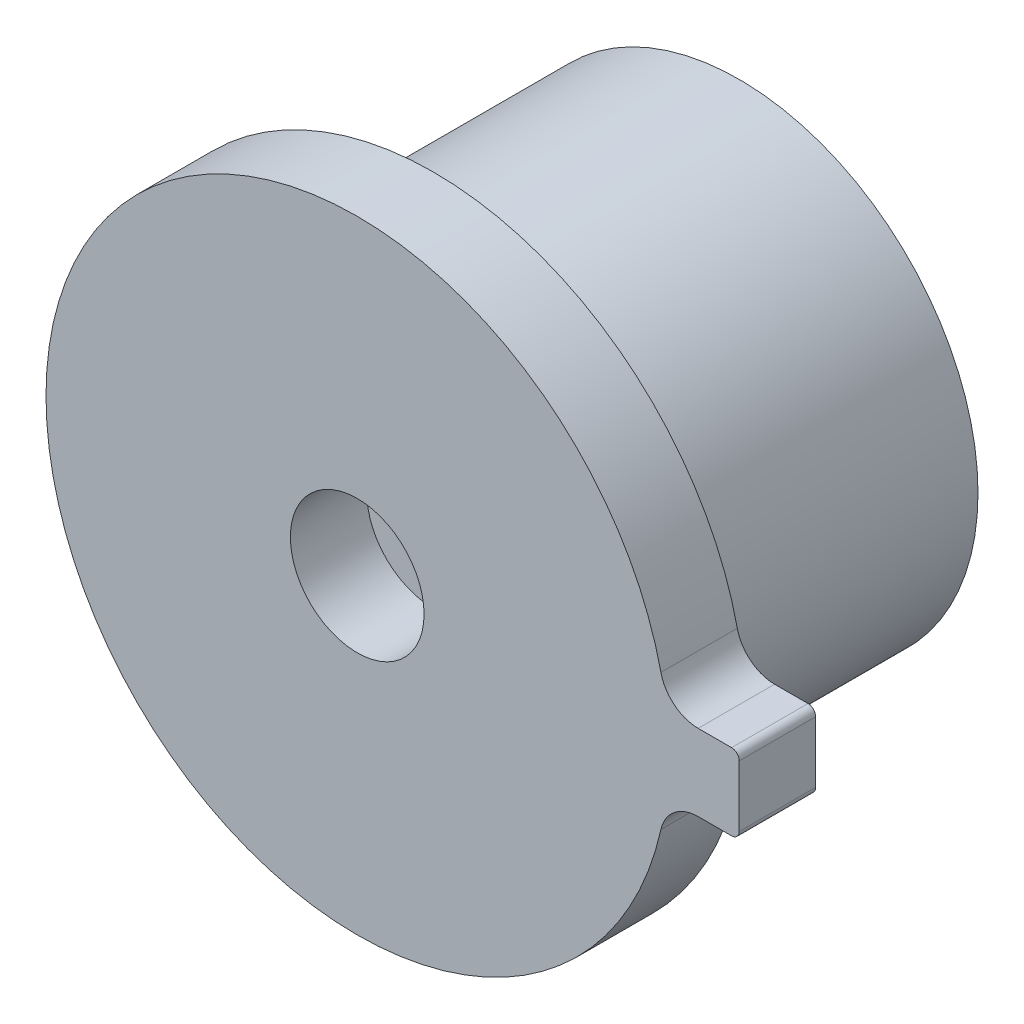
ISO-10303-21;
HEADER;
FILE_DESCRIPTION(('STEP AP214'),'2;1');
FILE_NAME('part.step','',(''),(''),'','','');
FILE_SCHEMA(('AUTOMOTIVE_DESIGN { 1 0 10303 214 1 1 1 1 }'));
ENDSEC;
DATA;
#1=APPLICATION_CONTEXT('core data for automotive mechanical design processes');
#2=APPLICATION_PROTOCOL_DEFINITION('international standard','automotive_design',2000,#1);
#3=PRODUCT_CONTEXT('',#1,'mechanical');
#4=PRODUCT('Part','Part','',(#3));
#5=PRODUCT_RELATED_PRODUCT_CATEGORY('part','',(#4));
#6=PRODUCT_DEFINITION_FORMATION('','',#4);
#7=PRODUCT_DEFINITION_CONTEXT('part definition',#1,'design');
#8=PRODUCT_DEFINITION('design','',#6,#7);
#9=PRODUCT_DEFINITION_SHAPE('','',#8);
#10=(LENGTH_UNIT() NAMED_UNIT(*) SI_UNIT(.MILLI.,.METRE.));
#11=(NAMED_UNIT(*) PLANE_ANGLE_UNIT() SI_UNIT($,.RADIAN.));
#12=(NAMED_UNIT(*) SI_UNIT($,.STERADIAN.) SOLID_ANGLE_UNIT());
#13=UNCERTAINTY_MEASURE_WITH_UNIT(LENGTH_MEASURE(1.E-05),#10,'distance_accuracy_value','');
#14=(GEOMETRIC_REPRESENTATION_CONTEXT(3) GLOBAL_UNCERTAINTY_ASSIGNED_CONTEXT((#13)) GLOBAL_UNIT_ASSIGNED_CONTEXT((#10,
#11,#12)) REPRESENTATION_CONTEXT('',''));
#15=CARTESIAN_POINT('',(0.,0.,0.));
#16=DIRECTION('',(0.,0.,1.));
#17=DIRECTION('',(1.,0.,0.));
#18=AXIS2_PLACEMENT_3D('',#15,#16,#17);
#19=CARTESIAN_POINT('',(0.,0.,16.));
#20=DIRECTION('',(0.,0.,-1.));
#21=DIRECTION('',(-1.,0.,0.));
#22=AXIS2_PLACEMENT_3D('',#19,#20,#21);
#23=CYLINDRICAL_SURFACE('',#22,2.);
#24=CARTESIAN_POINT('',(0.,0.,0.));
#25=DIRECTION('',(0.,0.,1.));
#26=DIRECTION('',(1.,0.,0.));
#27=AXIS2_PLACEMENT_3D('',#24,#25,#26);
#28=CIRCLE('',#27,2.);
#29=CARTESIAN_POINT('',(2.,0.,0.));
#30=VERTEX_POINT('',#29);
#31=EDGE_CURVE('E129',#30,#30,#28,.T.);
#32=ORIENTED_EDGE('',*,*,#31,.F.);
#33=EDGE_LOOP('',(#32));
#34=FACE_BOUND('',#33,.T.);
#35=CARTESIAN_POINT('',(0.,0.,16.));
#36=DIRECTION('',(0.,0.,1.));
#37=DIRECTION('',(1.,0.,0.));
#38=AXIS2_PLACEMENT_3D('',#35,#36,#37);
#39=CIRCLE('',#38,2.);
#40=CARTESIAN_POINT('',(2.,0.,16.));
#41=VERTEX_POINT('',#40);
#42=EDGE_CURVE('E145',#41,#41,#39,.T.);
#43=ORIENTED_EDGE('',*,*,#42,.T.);
#44=EDGE_LOOP('',(#43));
#45=FACE_BOUND('',#44,.T.);
#46=ADVANCED_FACE('F38',(#34,#45),#23,.F.);
#47=CARTESIAN_POINT('',(0.,0.,0.));
#48=DIRECTION('',(0.,0.,1.));
#49=DIRECTION('',(1.,0.,0.));
#50=AXIS2_PLACEMENT_3D('',#47,#48,#49);
#51=PLANE('',#50);
#52=CARTESIAN_POINT('',(6.,0.,0.));
#53=DIRECTION('',(0.,0.,-1.));
#54=DIRECTION('',(-1.,0.,0.));
#55=AXIS2_PLACEMENT_3D('',#52,#53,#54);
#56=CIRCLE('',#55,2.75);
#57=CARTESIAN_POINT('',(3.25,0.,0.));
#58=VERTEX_POINT('',#57);
#59=EDGE_CURVE('E265',#58,#58,#56,.T.);
#60=ORIENTED_EDGE('',*,*,#59,.F.);
#61=EDGE_LOOP('',(#60));
#62=FACE_BOUND('',#61,.T.);
#63=CARTESIAN_POINT('',(-3.,5.19615242270663,0.));
#64=DIRECTION('',(0.,0.,-1.));
#65=DIRECTION('',(-1.,0.,0.));
#66=AXIS2_PLACEMENT_3D('',#63,#64,#65);
#67=CIRCLE('',#66,2.75);
#68=CARTESIAN_POINT('',(-5.75,5.19615242270663,0.));
#69=VERTEX_POINT('',#68);
#70=EDGE_CURVE('E257',#69,#69,#67,.T.);
#71=ORIENTED_EDGE('',*,*,#70,.F.);
#72=EDGE_LOOP('',(#71));
#73=FACE_BOUND('',#72,.T.);
#74=CARTESIAN_POINT('',(-3.,-5.19615242270663,0.));
#75=DIRECTION('',(0.,0.,-1.));
#76=DIRECTION('',(-1.,0.,0.));
#77=AXIS2_PLACEMENT_3D('',#74,#75,#76);
#78=CIRCLE('',#77,2.75);
#79=CARTESIAN_POINT('',(-5.75,-5.19615242270663,0.));
#80=VERTEX_POINT('',#79);
#81=EDGE_CURVE('E249',#80,#80,#78,.T.);
#82=ORIENTED_EDGE('',*,*,#81,.F.);
#83=EDGE_LOOP('',(#82));
#84=FACE_BOUND('',#83,.T.);
#85=CARTESIAN_POINT('',(0.,0.,0.));
#86=DIRECTION('',(0.,0.,1.));
#87=DIRECTION('',(1.,0.,0.));
#88=AXIS2_PLACEMENT_3D('',#85,#86,#87);
#89=CIRCLE('',#88,12.5);
#90=CARTESIAN_POINT('',(12.5,0.,0.));
#91=VERTEX_POINT('',#90);
#92=EDGE_CURVE('E142',#91,#91,#89,.T.);
#93=ORIENTED_EDGE('',*,*,#92,.F.);
#94=EDGE_LOOP('',(#93));
#95=FACE_BOUND('',#94,.T.);
#96=ORIENTED_EDGE('',*,*,#31,.T.);
#97=EDGE_LOOP('',(#96));
#98=FACE_BOUND('',#97,.T.);
#99=ADVANCED_FACE('F231',(#62,#73,#84,#95,#98),#51,.F.);
#100=CARTESIAN_POINT('',(0.,0.,16.));
#101=DIRECTION('',(0.,0.,-1.));
#102=DIRECTION('',(-1.,0.,0.));
#103=AXIS2_PLACEMENT_3D('',#100,#101,#102);
#104=CYLINDRICAL_SURFACE('',#103,12.5);
#105=CARTESIAN_POINT('',(0.,0.,16.));
#106=DIRECTION('',(0.,0.,1.));
#107=DIRECTION('',(1.,0.,0.));
#108=AXIS2_PLACEMENT_3D('',#105,#106,#107);
#109=CIRCLE('',#108,12.5);
#110=CARTESIAN_POINT('',(12.5,0.,16.));
#111=VERTEX_POINT('',#110);
#112=EDGE_CURVE('E135',#111,#111,#109,.T.);
#113=ORIENTED_EDGE('',*,*,#112,.F.);
#114=EDGE_LOOP('',(#113));
#115=FACE_BOUND('',#114,.T.);
#116=ORIENTED_EDGE('',*,*,#92,.T.);
#117=EDGE_LOOP('',(#116));
#118=FACE_BOUND('',#117,.T.);
#119=ADVANCED_FACE('F229',(#115,#118),#104,.T.);
#120=CARTESIAN_POINT('',(0.,0.,20.));
#121=DIRECTION('',(0.,0.,1.));
#122=DIRECTION('',(1.,0.,0.));
#123=AXIS2_PLACEMENT_3D('',#120,#121,#122);
#124=PLANE('',#123);
#125=DIRECTION('',(1.,0.,0.));
#126=VECTOR('',#125,1.);
#127=CARTESIAN_POINT('',(20.,-2.,20.));
#128=LINE('',#127,#126);
#129=CARTESIAN_POINT('',(17.8505461799163,-2.,20.));
#130=VERTEX_POINT('',#129);
#131=CARTESIAN_POINT('',(19.6,-2.,20.));
#132=VERTEX_POINT('',#131);
#133=EDGE_CURVE('E199',#130,#132,#128,.T.);
#134=ORIENTED_EDGE('',*,*,#133,.T.);
#135=CARTESIAN_POINT('',(19.6,-1.6,20.));
#136=DIRECTION('',(0.,0.,1.));
#137=DIRECTION('',(1.,0.,0.));
#138=AXIS2_PLACEMENT_3D('',#135,#136,#137);
#139=CIRCLE('',#138,0.4);
#140=CARTESIAN_POINT('',(20.,-1.6,20.));
#141=VERTEX_POINT('',#140);
#142=EDGE_CURVE('E167',#132,#141,#139,.T.);
#143=ORIENTED_EDGE('',*,*,#142,.T.);
#144=DIRECTION('',(0.,1.,0.));
#145=VECTOR('',#144,1.);
#146=CARTESIAN_POINT('',(20.,2.,20.));
#147=LINE('',#146,#145);
#148=CARTESIAN_POINT('',(20.,1.6,20.));
#149=VERTEX_POINT('',#148);
#150=EDGE_CURVE('E198',#141,#149,#147,.T.);
#151=ORIENTED_EDGE('',*,*,#150,.T.);
#152=CARTESIAN_POINT('',(19.6,1.6,20.));
#153=DIRECTION('',(0.,0.,1.));
#154=DIRECTION('',(1.,0.,0.));
#155=AXIS2_PLACEMENT_3D('',#152,#153,#154);
#156=CIRCLE('',#155,0.4);
#157=CARTESIAN_POINT('',(19.6,2.,20.));
#158=VERTEX_POINT('',#157);
#159=EDGE_CURVE('E164',#149,#158,#156,.T.);
#160=ORIENTED_EDGE('',*,*,#159,.T.);
#161=DIRECTION('',(-1.,0.,0.));
#162=VECTOR('',#161,1.);
#163=CARTESIAN_POINT('',(20.,2.,20.));
#164=LINE('',#163,#162);
#165=CARTESIAN_POINT('',(17.8505461799163,2.,20.));
#166=VERTEX_POINT('',#165);
#167=EDGE_CURVE('E110',#158,#166,#164,.T.);
#168=ORIENTED_EDGE('',*,*,#167,.T.);
#169=CARTESIAN_POINT('',(17.8505461799163,4.,20.));
#170=DIRECTION('',(0.,0.,1.));
#171=DIRECTION('',(1.,0.,0.));
#172=AXIS2_PLACEMENT_3D('',#169,#170,#171);
#173=CIRCLE('',#172,2.);
#174=CARTESIAN_POINT('',(15.8989440576667,3.56267957236056,20.));
#175=VERTEX_POINT('',#174);
#176=EDGE_CURVE('E104',#166,#175,#173,.F.);
#177=ORIENTED_EDGE('',*,*,#176,.T.);
#178=CARTESIAN_POINT('',(0.,0.,20.));
#179=DIRECTION('',(0.,0.,1.));
#180=DIRECTION('',(1.,0.,0.));
#181=AXIS2_PLACEMENT_3D('',#178,#179,#180);
#182=CIRCLE('',#181,16.2932227592987);
#183=CARTESIAN_POINT('',(15.8989440576667,-3.56267957236056,20.));
#184=VERTEX_POINT('',#183);
#185=EDGE_CURVE('E109',#175,#184,#182,.T.);
#186=ORIENTED_EDGE('',*,*,#185,.T.);
#187=CARTESIAN_POINT('',(17.8505461799163,-4.,20.));
#188=DIRECTION('',(0.,0.,1.));
#189=DIRECTION('',(1.,0.,0.));
#190=AXIS2_PLACEMENT_3D('',#187,#188,#189);
#191=CIRCLE('',#190,2.);
#192=EDGE_CURVE('E153',#184,#130,#191,.F.);
#193=ORIENTED_EDGE('',*,*,#192,.T.);
#194=EDGE_LOOP('',(#134,#143,#151,#160,#168,#177,#186,#193));
#195=FACE_BOUND('',#194,.T.);
#196=CARTESIAN_POINT('',(0.,0.,20.));
#197=DIRECTION('',(0.,0.,1.));
#198=DIRECTION('',(1.,0.,0.));
#199=AXIS2_PLACEMENT_3D('',#196,#197,#198);
#200=CIRCLE('',#199,3.5);
#201=CARTESIAN_POINT('',(3.5,0.,20.));
#202=VERTEX_POINT('',#201);
#203=EDGE_CURVE('E216',#202,#202,#200,.T.);
#204=ORIENTED_EDGE('',*,*,#203,.F.);
#205=EDGE_LOOP('',(#204));
#206=FACE_BOUND('',#205,.T.);
#207=ADVANCED_FACE('F107',(#195,#206),#124,.T.);
#208=CARTESIAN_POINT('',(0.,0.,16.));
#209=DIRECTION('',(0.,0.,1.));
#210=DIRECTION('',(1.,0.,0.));
#211=AXIS2_PLACEMENT_3D('',#208,#209,#210);
#212=PLANE('',#211);
#213=ORIENTED_EDGE('',*,*,#112,.T.);
#214=EDGE_LOOP('',(#213));
#215=FACE_BOUND('',#214,.T.);
#216=DIRECTION('',(0.,1.,0.));
#217=VECTOR('',#216,1.);
#218=CARTESIAN_POINT('',(20.,2.,16.));
#219=LINE('',#218,#217);
#220=CARTESIAN_POINT('',(20.,-1.6,16.));
#221=VERTEX_POINT('',#220);
#222=CARTESIAN_POINT('',(20.,1.6,16.));
#223=VERTEX_POINT('',#222);
#224=EDGE_CURVE('E185',#221,#223,#219,.T.);
#225=ORIENTED_EDGE('',*,*,#224,.F.);
#226=CARTESIAN_POINT('',(19.6,-1.6,16.));
#227=DIRECTION('',(0.,0.,1.));
#228=DIRECTION('',(1.,0.,0.));
#229=AXIS2_PLACEMENT_3D('',#226,#227,#228);
#230=CIRCLE('',#229,0.4);
#231=CARTESIAN_POINT('',(19.6,-2.,16.));
#232=VERTEX_POINT('',#231);
#233=EDGE_CURVE('E47',#221,#232,#230,.F.);
#234=ORIENTED_EDGE('',*,*,#233,.T.);
#235=DIRECTION('',(1.,0.,0.));
#236=VECTOR('',#235,1.);
#237=CARTESIAN_POINT('',(20.,-2.,16.));
#238=LINE('',#237,#236);
#239=CARTESIAN_POINT('',(17.8505461799163,-2.,16.));
#240=VERTEX_POINT('',#239);
#241=EDGE_CURVE('E183',#240,#232,#238,.T.);
#242=ORIENTED_EDGE('',*,*,#241,.F.);
#243=CARTESIAN_POINT('',(17.8505461799163,-4.,16.));
#244=DIRECTION('',(0.,0.,1.));
#245=DIRECTION('',(1.,0.,0.));
#246=AXIS2_PLACEMENT_3D('',#243,#244,#245);
#247=CIRCLE('',#246,2.);
#248=CARTESIAN_POINT('',(15.8989440576667,-3.56267957236056,16.));
#249=VERTEX_POINT('',#248);
#250=EDGE_CURVE('E156',#240,#249,#247,.T.);
#251=ORIENTED_EDGE('',*,*,#250,.T.);
#252=CARTESIAN_POINT('',(0.,0.,16.));
#253=DIRECTION('',(0.,0.,1.));
#254=DIRECTION('',(1.,0.,0.));
#255=AXIS2_PLACEMENT_3D('',#252,#253,#254);
#256=CIRCLE('',#255,16.2932227592987);
#257=CARTESIAN_POINT('',(15.8989440576667,3.56267957236056,16.));
#258=VERTEX_POINT('',#257);
#259=EDGE_CURVE('E130',#258,#249,#256,.T.);
#260=ORIENTED_EDGE('',*,*,#259,.F.);
#261=CARTESIAN_POINT('',(17.8505461799163,4.,16.));
#262=DIRECTION('',(0.,0.,1.));
#263=DIRECTION('',(1.,0.,0.));
#264=AXIS2_PLACEMENT_3D('',#261,#262,#263);
#265=CIRCLE('',#264,2.);
#266=CARTESIAN_POINT('',(17.8505461799163,2.,16.));
#267=VERTEX_POINT('',#266);
#268=EDGE_CURVE('E117',#258,#267,#265,.T.);
#269=ORIENTED_EDGE('',*,*,#268,.T.);
#270=DIRECTION('',(-1.,0.,0.));
#271=VECTOR('',#270,1.);
#272=CARTESIAN_POINT('',(20.,2.,16.));
#273=LINE('',#272,#271);
#274=CARTESIAN_POINT('',(19.6,2.,16.));
#275=VERTEX_POINT('',#274);
#276=EDGE_CURVE('E219',#275,#267,#273,.T.);
#277=ORIENTED_EDGE('',*,*,#276,.F.);
#278=CARTESIAN_POINT('',(19.6,1.6,16.));
#279=DIRECTION('',(0.,0.,1.));
#280=DIRECTION('',(1.,0.,0.));
#281=AXIS2_PLACEMENT_3D('',#278,#279,#280);
#282=CIRCLE('',#281,0.4);
#283=EDGE_CURVE('E59',#275,#223,#282,.F.);
#284=ORIENTED_EDGE('',*,*,#283,.T.);
#285=EDGE_LOOP('',(#225,#234,#242,#251,#260,#269,#277,#284));
#286=FACE_BOUND('',#285,.T.);
#287=ADVANCED_FACE('F182',(#215,#286),#212,.F.);
#288=CARTESIAN_POINT('',(0.,0.,20.));
#289=DIRECTION('',(0.,0.,-1.));
#290=DIRECTION('',(-1.,0.,0.));
#291=AXIS2_PLACEMENT_3D('',#288,#289,#290);
#292=CYLINDRICAL_SURFACE('',#291,16.2932227592987);
#293=ORIENTED_EDGE('',*,*,#259,.T.);
#294=DIRECTION('',(0.,0.,-1.));
#295=VECTOR('',#294,1.);
#296=CARTESIAN_POINT('',(15.8989440576667,-3.56267957236056,20.));
#297=LINE('',#296,#295);
#298=EDGE_CURVE('E127',#249,#184,#297,.F.);
#299=ORIENTED_EDGE('',*,*,#298,.T.);
#300=ORIENTED_EDGE('',*,*,#185,.F.);
#301=DIRECTION('',(0.,0.,-1.));
#302=VECTOR('',#301,1.);
#303=CARTESIAN_POINT('',(15.8989440576667,3.56267957236056,20.));
#304=LINE('',#303,#302);
#305=EDGE_CURVE('E124',#175,#258,#304,.T.);
#306=ORIENTED_EDGE('',*,*,#305,.T.);
#307=EDGE_LOOP('',(#293,#299,#300,#306));
#308=FACE_BOUND('',#307,.T.);
#309=ADVANCED_FACE('F123',(#308),#292,.T.);
#310=CARTESIAN_POINT('',(0.,0.,16.));
#311=DIRECTION('',(0.,0.,1.));
#312=DIRECTION('',(1.,0.,0.));
#313=AXIS2_PLACEMENT_3D('',#310,#311,#312);
#314=CYLINDRICAL_SURFACE('',#313,3.5);
#315=CARTESIAN_POINT('',(0.,0.,16.));
#316=DIRECTION('',(0.,0.,1.));
#317=DIRECTION('',(1.,0.,0.));
#318=AXIS2_PLACEMENT_3D('',#315,#316,#317);
#319=CIRCLE('',#318,3.5);
#320=CARTESIAN_POINT('',(3.5,0.,16.));
#321=VERTEX_POINT('',#320);
#322=EDGE_CURVE('E212',#321,#321,#319,.T.);
#323=ORIENTED_EDGE('',*,*,#322,.F.);
#324=EDGE_LOOP('',(#323));
#325=FACE_BOUND('',#324,.T.);
#326=ORIENTED_EDGE('',*,*,#203,.T.);
#327=EDGE_LOOP('',(#326));
#328=FACE_BOUND('',#327,.T.);
#329=ADVANCED_FACE('F313',(#325,#328),#314,.F.);
#330=CARTESIAN_POINT('',(0.,0.,16.));
#331=DIRECTION('',(0.,0.,1.));
#332=DIRECTION('',(1.,0.,0.));
#333=AXIS2_PLACEMENT_3D('',#330,#331,#332);
#334=PLANE('',#333);
#335=ORIENTED_EDGE('',*,*,#42,.F.);
#336=EDGE_LOOP('',(#335));
#337=FACE_BOUND('',#336,.T.);
#338=ORIENTED_EDGE('',*,*,#322,.T.);
#339=EDGE_LOOP('',(#338));
#340=FACE_BOUND('',#339,.T.);
#341=ADVANCED_FACE('F305',(#337,#340),#334,.T.);
#342=CARTESIAN_POINT('',(20.,2.,16.));
#343=DIRECTION('',(0.,1.,0.));
#344=DIRECTION('',(-1.,0.,0.));
#345=AXIS2_PLACEMENT_3D('',#342,#343,#344);
#346=PLANE('',#345);
#347=ORIENTED_EDGE('',*,*,#167,.F.);
#348=DIRECTION('',(0.,0.,1.));
#349=VECTOR('',#348,1.);
#350=CARTESIAN_POINT('',(19.6,2.,16.));
#351=LINE('',#350,#349);
#352=EDGE_CURVE('E11',#158,#275,#351,.F.);
#353=ORIENTED_EDGE('',*,*,#352,.T.);
#354=ORIENTED_EDGE('',*,*,#276,.T.);
#355=DIRECTION('',(0.,0.,-1.));
#356=VECTOR('',#355,1.);
#357=CARTESIAN_POINT('',(17.8505461799163,2.,16.));
#358=LINE('',#357,#356);
#359=EDGE_CURVE('E150',#267,#166,#358,.F.);
#360=ORIENTED_EDGE('',*,*,#359,.T.);
#361=EDGE_LOOP('',(#347,#353,#354,#360));
#362=FACE_BOUND('',#361,.T.);
#363=ADVANCED_FACE('F302',(#362),#346,.T.);
#364=CARTESIAN_POINT('',(20.,-2.,16.));
#365=DIRECTION('',(0.,-1.,0.));
#366=DIRECTION('',(1.,0.,0.));
#367=AXIS2_PLACEMENT_3D('',#364,#365,#366);
#368=PLANE('',#367);
#369=ORIENTED_EDGE('',*,*,#241,.T.);
#370=DIRECTION('',(0.,0.,1.));
#371=VECTOR('',#370,1.);
#372=CARTESIAN_POINT('',(19.6,-2.,16.));
#373=LINE('',#372,#371);
#374=EDGE_CURVE('E116',#232,#132,#373,.T.);
#375=ORIENTED_EDGE('',*,*,#374,.T.);
#376=ORIENTED_EDGE('',*,*,#133,.F.);
#377=DIRECTION('',(0.,0.,-1.));
#378=VECTOR('',#377,1.);
#379=CARTESIAN_POINT('',(17.8505461799163,-2.,16.));
#380=LINE('',#379,#378);
#381=EDGE_CURVE('E139',#130,#240,#380,.T.);
#382=ORIENTED_EDGE('',*,*,#381,.T.);
#383=EDGE_LOOP('',(#369,#375,#376,#382));
#384=FACE_BOUND('',#383,.T.);
#385=ADVANCED_FACE('F190',(#384),#368,.T.);
#386=CARTESIAN_POINT('',(20.,2.,16.));
#387=DIRECTION('',(1.,0.,0.));
#388=DIRECTION('',(0.,0.,-1.));
#389=AXIS2_PLACEMENT_3D('',#386,#387,#388);
#390=PLANE('',#389);
#391=ORIENTED_EDGE('',*,*,#150,.F.);
#392=DIRECTION('',(0.,0.,1.));
#393=VECTOR('',#392,1.);
#394=CARTESIAN_POINT('',(20.,-1.6,16.));
#395=LINE('',#394,#393);
#396=EDGE_CURVE('E174',#141,#221,#395,.F.);
#397=ORIENTED_EDGE('',*,*,#396,.T.);
#398=ORIENTED_EDGE('',*,*,#224,.T.);
#399=DIRECTION('',(0.,0.,1.));
#400=VECTOR('',#399,1.);
#401=CARTESIAN_POINT('',(20.,1.6,16.));
#402=LINE('',#401,#400);
#403=EDGE_CURVE('E170',#223,#149,#402,.T.);
#404=ORIENTED_EDGE('',*,*,#403,.T.);
#405=EDGE_LOOP('',(#391,#397,#398,#404));
#406=FACE_BOUND('',#405,.T.);
#407=ADVANCED_FACE('F201',(#406),#390,.T.);
#408=CARTESIAN_POINT('',(17.8505461799163,-4.,20.));
#409=DIRECTION('',(0.,0.,-1.));
#410=DIRECTION('',(-1.,0.,0.));
#411=AXIS2_PLACEMENT_3D('',#408,#409,#410);
#412=CYLINDRICAL_SURFACE('',#411,2.);
#413=ORIENTED_EDGE('',*,*,#250,.F.);
#414=ORIENTED_EDGE('',*,*,#381,.F.);
#415=ORIENTED_EDGE('',*,*,#192,.F.);
#416=ORIENTED_EDGE('',*,*,#298,.F.);
#417=EDGE_LOOP('',(#413,#414,#415,#416));
#418=FACE_BOUND('',#417,.T.);
#419=ADVANCED_FACE('F308',(#418),#412,.F.);
#420=CARTESIAN_POINT('',(17.8505461799163,4.,20.));
#421=DIRECTION('',(0.,0.,-1.));
#422=DIRECTION('',(-1.,0.,0.));
#423=AXIS2_PLACEMENT_3D('',#420,#421,#422);
#424=CYLINDRICAL_SURFACE('',#423,2.);
#425=ORIENTED_EDGE('',*,*,#176,.F.);
#426=ORIENTED_EDGE('',*,*,#359,.F.);
#427=ORIENTED_EDGE('',*,*,#268,.F.);
#428=ORIENTED_EDGE('',*,*,#305,.F.);
#429=EDGE_LOOP('',(#425,#426,#427,#428));
#430=FACE_BOUND('',#429,.T.);
#431=ADVANCED_FACE('F132',(#430),#424,.F.);
#432=CARTESIAN_POINT('',(19.6,-1.6,16.));
#433=DIRECTION('',(0.,0.,1.));
#434=DIRECTION('',(1.,0.,0.));
#435=AXIS2_PLACEMENT_3D('',#432,#433,#434);
#436=CYLINDRICAL_SURFACE('',#435,0.4);
#437=ORIENTED_EDGE('',*,*,#233,.F.);
#438=ORIENTED_EDGE('',*,*,#396,.F.);
#439=ORIENTED_EDGE('',*,*,#142,.F.);
#440=ORIENTED_EDGE('',*,*,#374,.F.);
#441=EDGE_LOOP('',(#437,#438,#439,#440));
#442=FACE_BOUND('',#441,.T.);
#443=ADVANCED_FACE('F195',(#442),#436,.T.);
#444=CARTESIAN_POINT('',(19.6,1.6,16.));
#445=DIRECTION('',(0.,0.,1.));
#446=DIRECTION('',(1.,0.,0.));
#447=AXIS2_PLACEMENT_3D('',#444,#445,#446);
#448=CYLINDRICAL_SURFACE('',#447,0.4);
#449=ORIENTED_EDGE('',*,*,#283,.F.);
#450=ORIENTED_EDGE('',*,*,#352,.F.);
#451=ORIENTED_EDGE('',*,*,#159,.F.);
#452=ORIENTED_EDGE('',*,*,#403,.F.);
#453=EDGE_LOOP('',(#449,#450,#451,#452));
#454=FACE_BOUND('',#453,.T.);
#455=ADVANCED_FACE('F40',(#454),#448,.T.);
#456=CARTESIAN_POINT('',(-3.,-5.19615242270663,5.));
#457=DIRECTION('',(0.,0.,-1.));
#458=DIRECTION('',(-1.,0.,0.));
#459=AXIS2_PLACEMENT_3D('',#456,#457,#458);
#460=CYLINDRICAL_SURFACE('',#459,2.75);
#461=CARTESIAN_POINT('',(-3.,-5.19615242270663,5.));
#462=DIRECTION('',(0.,0.,-1.));
#463=DIRECTION('',(-1.,0.,0.));
#464=AXIS2_PLACEMENT_3D('',#461,#462,#463);
#465=CIRCLE('',#464,2.75);
#466=CARTESIAN_POINT('',(-5.75,-5.19615242270663,5.));
#467=VERTEX_POINT('',#466);
#468=EDGE_CURVE('E253',#467,#467,#465,.T.);
#469=ORIENTED_EDGE('',*,*,#468,.F.);
#470=EDGE_LOOP('',(#469));
#471=FACE_BOUND('',#470,.T.);
#472=ORIENTED_EDGE('',*,*,#81,.T.);
#473=EDGE_LOOP('',(#472));
#474=FACE_BOUND('',#473,.T.);
#475=ADVANCED_FACE('F286',(#471,#474),#460,.F.);
#476=CARTESIAN_POINT('',(-3.,-5.19615242270663,5.));
#477=DIRECTION('',(0.,0.,-1.));
#478=DIRECTION('',(-1.,0.,0.));
#479=AXIS2_PLACEMENT_3D('',#476,#477,#478);
#480=PLANE('',#479);
#481=ORIENTED_EDGE('',*,*,#468,.T.);
#482=EDGE_LOOP('',(#481));
#483=FACE_BOUND('',#482,.T.);
#484=ADVANCED_FACE('F288',(#483),#480,.T.);
#485=CARTESIAN_POINT('',(-3.,5.19615242270663,5.));
#486=DIRECTION('',(0.,0.,-1.));
#487=DIRECTION('',(-1.,0.,0.));
#488=AXIS2_PLACEMENT_3D('',#485,#486,#487);
#489=CYLINDRICAL_SURFACE('',#488,2.75);
#490=CARTESIAN_POINT('',(-3.,5.19615242270663,5.));
#491=DIRECTION('',(0.,0.,-1.));
#492=DIRECTION('',(-1.,0.,0.));
#493=AXIS2_PLACEMENT_3D('',#490,#491,#492);
#494=CIRCLE('',#493,2.75);
#495=CARTESIAN_POINT('',(-5.75,5.19615242270663,5.));
#496=VERTEX_POINT('',#495);
#497=EDGE_CURVE('E261',#496,#496,#494,.T.);
#498=ORIENTED_EDGE('',*,*,#497,.F.);
#499=EDGE_LOOP('',(#498));
#500=FACE_BOUND('',#499,.T.);
#501=ORIENTED_EDGE('',*,*,#70,.T.);
#502=EDGE_LOOP('',(#501));
#503=FACE_BOUND('',#502,.T.);
#504=ADVANCED_FACE('F295',(#500,#503),#489,.F.);
#505=CARTESIAN_POINT('',(-3.,5.19615242270663,5.));
#506=DIRECTION('',(0.,0.,-1.));
#507=DIRECTION('',(-1.,0.,0.));
#508=AXIS2_PLACEMENT_3D('',#505,#506,#507);
#509=PLANE('',#508);
#510=ORIENTED_EDGE('',*,*,#497,.T.);
#511=EDGE_LOOP('',(#510));
#512=FACE_BOUND('',#511,.T.);
#513=ADVANCED_FACE('F278',(#512),#509,.T.);
#514=CARTESIAN_POINT('',(6.,0.,5.));
#515=DIRECTION('',(0.,0.,-1.));
#516=DIRECTION('',(-1.,0.,0.));
#517=AXIS2_PLACEMENT_3D('',#514,#515,#516);
#518=CYLINDRICAL_SURFACE('',#517,2.75);
#519=CARTESIAN_POINT('',(6.,0.,5.));
#520=DIRECTION('',(0.,0.,-1.));
#521=DIRECTION('',(-1.,0.,0.));
#522=AXIS2_PLACEMENT_3D('',#519,#520,#521);
#523=CIRCLE('',#522,2.75);
#524=CARTESIAN_POINT('',(3.25,0.,5.));
#525=VERTEX_POINT('',#524);
#526=EDGE_CURVE('E208',#525,#525,#523,.T.);
#527=ORIENTED_EDGE('',*,*,#526,.F.);
#528=EDGE_LOOP('',(#527));
#529=FACE_BOUND('',#528,.T.);
#530=ORIENTED_EDGE('',*,*,#59,.T.);
#531=EDGE_LOOP('',(#530));
#532=FACE_BOUND('',#531,.T.);
#533=ADVANCED_FACE('F275',(#529,#532),#518,.F.);
#534=CARTESIAN_POINT('',(6.,0.,5.));
#535=DIRECTION('',(0.,0.,-1.));
#536=DIRECTION('',(-1.,0.,0.));
#537=AXIS2_PLACEMENT_3D('',#534,#535,#536);
#538=PLANE('',#537);
#539=ORIENTED_EDGE('',*,*,#526,.T.);
#540=EDGE_LOOP('',(#539));
#541=FACE_BOUND('',#540,.T.);
#542=ADVANCED_FACE('F273',(#541),#538,.T.);
#543=CLOSED_SHELL('',(#46,#99,#119,#207,#287,#309,#329,#341,#363,#385,#407,#419,#431,#443,#455,
#475,#484,#504,#513,#533,#542));
#544=MANIFOLD_SOLID_BREP('B2',#543);
#545=ADVANCED_BREP_SHAPE_REPRESENTATION('',(#18,#544),#14);
#546=SHAPE_DEFINITION_REPRESENTATION(#9,#545);
ENDSEC;
END-ISO-10303-21;
